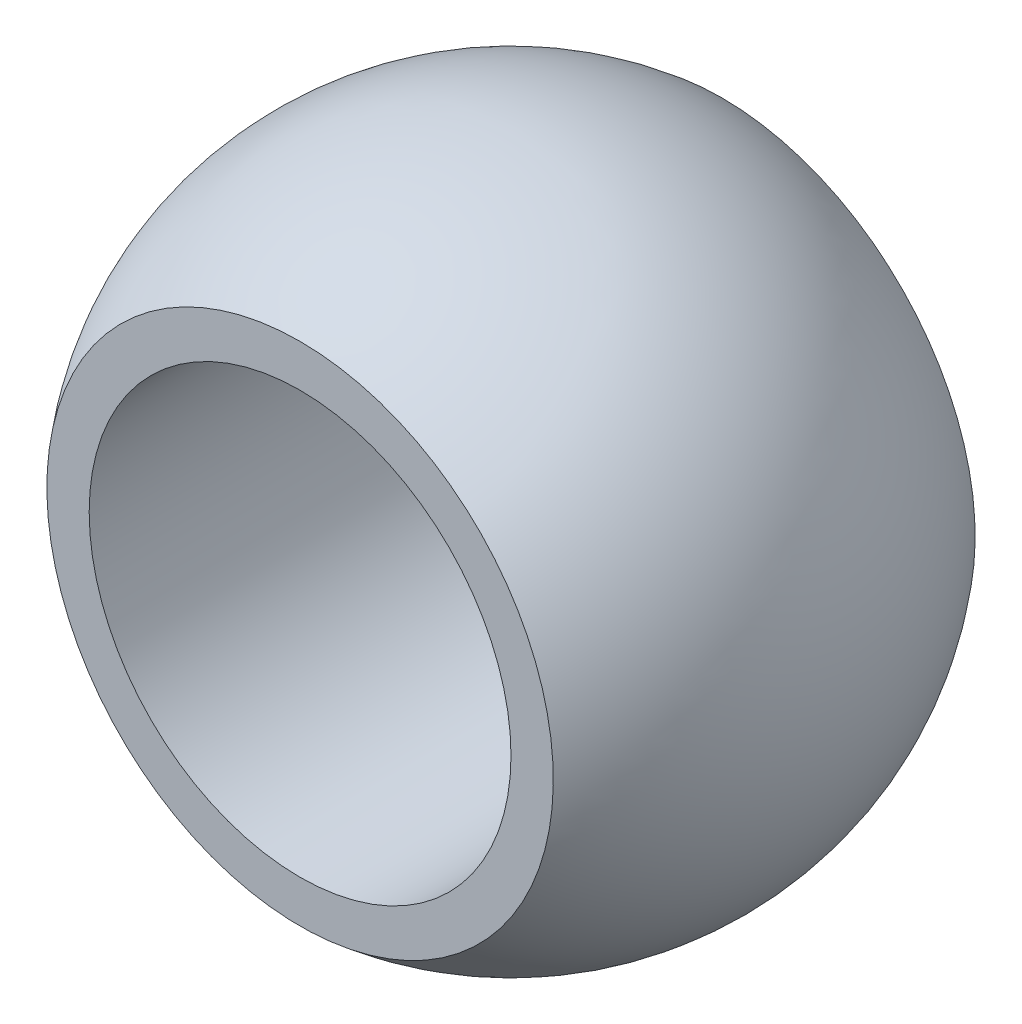
ISO-10303-21;
HEADER;
FILE_DESCRIPTION(('STEP AP214'),'2;1');
FILE_NAME('part.step','',(''),(''),'','','');
FILE_SCHEMA(('AUTOMOTIVE_DESIGN { 1 0 10303 214 1 1 1 1 }'));
ENDSEC;
DATA;
#1=APPLICATION_CONTEXT('core data for automotive mechanical design processes');
#2=APPLICATION_PROTOCOL_DEFINITION('international standard','automotive_design',2000,#1);
#3=PRODUCT_CONTEXT('',#1,'mechanical');
#4=PRODUCT('Part','Part','',(#3));
#5=PRODUCT_RELATED_PRODUCT_CATEGORY('part','',(#4));
#6=PRODUCT_DEFINITION_FORMATION('','',#4);
#7=PRODUCT_DEFINITION_CONTEXT('part definition',#1,'design');
#8=PRODUCT_DEFINITION('design','',#6,#7);
#9=PRODUCT_DEFINITION_SHAPE('','',#8);
#10=(LENGTH_UNIT() NAMED_UNIT(*) SI_UNIT(.MILLI.,.METRE.));
#11=(NAMED_UNIT(*) PLANE_ANGLE_UNIT() SI_UNIT($,.RADIAN.));
#12=(NAMED_UNIT(*) SI_UNIT($,.STERADIAN.) SOLID_ANGLE_UNIT());
#13=UNCERTAINTY_MEASURE_WITH_UNIT(LENGTH_MEASURE(1.E-05),#10,'distance_accuracy_value','');
#14=(GEOMETRIC_REPRESENTATION_CONTEXT(3) GLOBAL_UNCERTAINTY_ASSIGNED_CONTEXT((#13)) GLOBAL_UNIT_ASSIGNED_CONTEXT((#10,
#11,#12)) REPRESENTATION_CONTEXT('',''));
#15=CARTESIAN_POINT('',(0.,0.,0.));
#16=DIRECTION('',(0.,0.,1.));
#17=DIRECTION('',(1.,0.,0.));
#18=AXIS2_PLACEMENT_3D('',#15,#16,#17);
#19=CARTESIAN_POINT('',(0.,4.80234317807464,4.));
#20=DIRECTION('',(0.,0.,-1.));
#21=DIRECTION('',(-1.,0.,0.));
#22=AXIS2_PLACEMENT_3D('',#19,#20,#21);
#23=PLANE('',#22);
#24=CARTESIAN_POINT('',(0.,0.,4.));
#25=DIRECTION('',(0.,0.,1.));
#26=DIRECTION('',(1.,0.,0.));
#27=AXIS2_PLACEMENT_3D('',#24,#25,#26);
#28=CIRCLE('',#27,4.);
#29=CARTESIAN_POINT('',(4.,0.,4.));
#30=VERTEX_POINT('',#29);
#31=EDGE_CURVE('E10',#30,#30,#28,.T.);
#32=ORIENTED_EDGE('',*,*,#31,.F.);
#33=EDGE_LOOP('',(#32));
#34=FACE_BOUND('',#33,.T.);
#35=CARTESIAN_POINT('',(0.,0.,4.));
#36=DIRECTION('',(0.,0.,1.));
#37=DIRECTION('',(1.,0.,0.));
#38=AXIS2_PLACEMENT_3D('',#35,#36,#37);
#39=CIRCLE('',#38,4.80234317807464);
#40=CARTESIAN_POINT('',(0.,4.80234317807464,4.));
#41=VERTEX_POINT('',#40);
#42=EDGE_CURVE('E44',#41,#41,#39,.T.);
#43=ORIENTED_EDGE('',*,*,#42,.T.);
#44=EDGE_LOOP('',(#43));
#45=FACE_BOUND('',#44,.T.);
#46=ADVANCED_FACE('F30',(#34,#45),#23,.F.);
#47=CARTESIAN_POINT('',(0.,0.,4.));
#48=DIRECTION('',(0.,0.,1.));
#49=DIRECTION('',(1.,0.,0.));
#50=AXIS2_PLACEMENT_3D('',#47,#48,#49);
#51=CYLINDRICAL_SURFACE('',#50,4.);
#52=CARTESIAN_POINT('',(0.,0.,-4.));
#53=DIRECTION('',(0.,0.,1.));
#54=DIRECTION('',(1.,0.,0.));
#55=AXIS2_PLACEMENT_3D('',#52,#53,#54);
#56=CIRCLE('',#55,4.);
#57=CARTESIAN_POINT('',(4.,0.,-4.));
#58=VERTEX_POINT('',#57);
#59=EDGE_CURVE('E36',#58,#58,#56,.T.);
#60=ORIENTED_EDGE('',*,*,#59,.F.);
#61=EDGE_LOOP('',(#60));
#62=FACE_BOUND('',#61,.T.);
#63=ORIENTED_EDGE('',*,*,#31,.T.);
#64=EDGE_LOOP('',(#63));
#65=FACE_BOUND('',#64,.T.);
#66=ADVANCED_FACE('F59',(#62,#65),#51,.F.);
#67=CARTESIAN_POINT('',(0.,4.80234317807464,-4.));
#68=DIRECTION('',(0.,0.,1.));
#69=DIRECTION('',(1.,0.,0.));
#70=AXIS2_PLACEMENT_3D('',#67,#68,#69);
#71=PLANE('',#70);
#72=CARTESIAN_POINT('',(0.,0.,-4.));
#73=DIRECTION('',(0.,0.,1.));
#74=DIRECTION('',(1.,0.,0.));
#75=AXIS2_PLACEMENT_3D('',#72,#73,#74);
#76=CIRCLE('',#75,4.80234317807464);
#77=CARTESIAN_POINT('',(0.,4.80234317807464,-4.));
#78=VERTEX_POINT('',#77);
#79=EDGE_CURVE('E40',#78,#78,#76,.T.);
#80=ORIENTED_EDGE('',*,*,#79,.F.);
#81=EDGE_LOOP('',(#80));
#82=FACE_BOUND('',#81,.T.);
#83=ORIENTED_EDGE('',*,*,#59,.T.);
#84=EDGE_LOOP('',(#83));
#85=FACE_BOUND('',#84,.T.);
#86=ADVANCED_FACE('F54',(#82,#85),#71,.F.);
#87=CARTESIAN_POINT('',(0.,0.,0.));
#88=DIRECTION('',(0.,0.,1.));
#89=DIRECTION('',(0.,1.,0.));
#90=AXIS2_PLACEMENT_3D('',#87,#88,#89);
#91=SPHERICAL_SURFACE('',#90,6.25);
#92=CARTESIAN_POINT('',(0.,4.80234317807464,4.));
#93=CARTESIAN_POINT('',(0.,4.86021908865252,3.93051707682293));
#94=CARTESIAN_POINT('',(0.,4.9165849226692,3.85977650040231));
#95=CARTESIAN_POINT('',(0.,5.02619489369063,3.7159168357477));
#96=CARTESIAN_POINT('',(0.,5.07943903069538,3.64279774751371));
#97=CARTESIAN_POINT('',(0.,5.1827040638034,3.49431785390617));
#98=CARTESIAN_POINT('',(0.,5.23272495990667,3.4189570485326));
#99=CARTESIAN_POINT('',(0.,5.32944961496876,3.26613593884275));
#100=CARTESIAN_POINT('',(0.,5.37615337392757,3.18867563452645));
#101=CARTESIAN_POINT('',(0.,5.46615568506055,3.03180137848343));
#102=CARTESIAN_POINT('',(0.,5.50945423723472,2.9523874267567));
#103=CARTESIAN_POINT('',(0.,5.59256459300888,2.79175549389879));
#104=CARTESIAN_POINT('',(0.,5.63237639660886,2.71053751276763));
#105=CARTESIAN_POINT('',(0.,5.70843825145934,2.54645051443596));
#106=CARTESIAN_POINT('',(0.,5.74468830270983,2.46358149723546));
#107=CARTESIAN_POINT('',(0.,5.81355836682803,2.29634853650632));
#108=CARTESIAN_POINT('',(0.,5.84617837969574,2.21198459297768));
#109=CARTESIAN_POINT('',(0.,5.90772691709532,2.04192070381338));
#110=CARTESIAN_POINT('',(0.,5.93665544162718,1.95622075817773));
#111=CARTESIAN_POINT('',(0.,5.99076650700101,1.7836463062221));
#112=CARTESIAN_POINT('',(0.,6.01594904784297,1.69677179990212));
#113=CARTESIAN_POINT('',(0.,6.0625207070008,1.52201188051573));
#114=CARTESIAN_POINT('',(0.,6.08390982531665,1.43412646744932));
#115=CARTESIAN_POINT('',(0.,6.12285434666711,1.25751029288328));
#116=CARTESIAN_POINT('',(0.,6.14040974970171,1.16877953138367));
#117=CARTESIAN_POINT('',(0.,6.17165376966595,0.990639810721027));
#118=CARTESIAN_POINT('',(0.,6.18534238659558,0.901230851558007));
#119=CARTESIAN_POINT('',(0.,6.20882704777047,0.721903163927604));
#120=CARTESIAN_POINT('',(0.,6.21862309201573,0.631984435460222));
#121=CARTESIAN_POINT('',(0.,6.23430415405971,0.451806597881577));
#122=CARTESIAN_POINT('',(0.,6.24018917185844,0.361547488770314));
#123=CARTESIAN_POINT('',(0.,6.24803709482858,0.1808589197727));
#124=CARTESIAN_POINT('',(0.,6.25,0.0904294598863502));
#125=CARTESIAN_POINT('',(0.,6.25,-0.0904294598863502));
#126=CARTESIAN_POINT('',(0.,6.24803709482858,-0.1808589197727));
#127=CARTESIAN_POINT('',(0.,6.24018917185844,-0.361547488770314));
#128=CARTESIAN_POINT('',(0.,6.23430415405971,-0.451806597881577));
#129=CARTESIAN_POINT('',(0.,6.21862309201573,-0.631984435460222));
#130=CARTESIAN_POINT('',(0.,6.20882704777047,-0.721903163927604));
#131=CARTESIAN_POINT('',(0.,6.18534238659558,-0.901230851558007));
#132=CARTESIAN_POINT('',(0.,6.17165376966595,-0.990639810721027));
#133=CARTESIAN_POINT('',(0.,6.14040974970171,-1.16877953138367));
#134=CARTESIAN_POINT('',(0.,6.12285434666711,-1.25751029288328));
#135=CARTESIAN_POINT('',(0.,6.08390982531665,-1.43412646744932));
#136=CARTESIAN_POINT('',(0.,6.0625207070008,-1.52201188051573));
#137=CARTESIAN_POINT('',(0.,6.01594904784297,-1.69677179990212));
#138=CARTESIAN_POINT('',(0.,5.99076650700101,-1.7836463062221));
#139=CARTESIAN_POINT('',(0.,5.93665544162718,-1.95622075817773));
#140=CARTESIAN_POINT('',(0.,5.90772691709532,-2.04192070381338));
#141=CARTESIAN_POINT('',(0.,5.84617837969574,-2.21198459297768));
#142=CARTESIAN_POINT('',(0.,5.81355836682803,-2.29634853650632));
#143=CARTESIAN_POINT('',(0.,5.74468830270983,-2.46358149723546));
#144=CARTESIAN_POINT('',(0.,5.70843825145934,-2.54645051443596));
#145=CARTESIAN_POINT('',(0.,5.63237639660886,-2.71053751276763));
#146=CARTESIAN_POINT('',(0.,5.59256459300888,-2.79175549389879));
#147=CARTESIAN_POINT('',(0.,5.50945423723472,-2.9523874267567));
#148=CARTESIAN_POINT('',(0.,5.46615568506055,-3.03180137848343));
#149=CARTESIAN_POINT('',(0.,5.37615337392757,-3.18867563452645));
#150=CARTESIAN_POINT('',(0.,5.32944961496876,-3.26613593884275));
#151=CARTESIAN_POINT('',(0.,5.23272495990667,-3.4189570485326));
#152=CARTESIAN_POINT('',(0.,5.1827040638034,-3.49431785390617));
#153=CARTESIAN_POINT('',(0.,5.07943903069538,-3.64279774751371));
#154=CARTESIAN_POINT('',(0.,5.02619489369063,-3.7159168357477));
#155=CARTESIAN_POINT('',(0.,4.9165849226692,-3.85977650040231));
#156=CARTESIAN_POINT('',(0.,4.86021908865252,-3.93051707682293));
#157=CARTESIAN_POINT('',(0.,4.80234317807464,-4.));
#158=B_SPLINE_CURVE_WITH_KNOTS('',3,(#92,#93,#94,#95,#96,#97,#98,#99,#100,#101,#102,#103,#104,
#105,#106,#107,#108,#109,#110,#111,#112,#113,#114,#115,#116,#117,#118,#119,#120,#121,#122,#123,
#124,#125,#126,#127,#128,#129,#130,#131,#132,#133,#134,#135,#136,#137,#138,#139,#140,#141,#142,
#143,#144,#145,#146,#147,#148,#149,#150,#151,#152,#153,#154,#155,#156,#157),.UNSPECIFIED.,.F.,
.F.,(4,2,2,2,2,2,2,2,2,2,2,2,2,2,2,2,2,2,2,2,2,2,2,2,2,2,2,2,2,2,2,2,4),(0.,0.27126708832102,
0.542534176642041,0.81380126496306,1.08506835328408,1.3563354416051,1.62760252992612,
1.89886961824714,2.17013670656816,2.44140379488918,2.7126708832102,2.98393797153122,
3.25520505985224,3.52647214817326,3.79773923649428,4.0690063248153,4.34027341313632,
4.61154050145734,4.88280758977836,5.15407467809938,5.4253417664204,5.69660885474142,
5.96787594306245,6.23914303138347,6.51041011970449,6.78167720802551,7.05294429634653,
7.32421138466755,7.59547847298857,7.86674556130959,8.13801264963061,8.40927973795162,
8.68054682627264),.UNSPECIFIED.);
#159=EDGE_CURVE('BSEAM51',#41,#78,#158,.T.);
#160=ORIENTED_EDGE('',*,*,#42,.F.);
#161=ORIENTED_EDGE('',*,*,#79,.T.);
#162=ORIENTED_EDGE('',*,*,#159,.T.);
#163=ORIENTED_EDGE('',*,*,#159,.F.);
#164=EDGE_LOOP('',(#160,#162,#161,#163));
#165=FACE_BOUND('',#164,.T.);
#166=ADVANCED_FACE('F51',(#165),#91,.T.);
#167=CLOSED_SHELL('',(#46,#66,#86,#166));
#168=MANIFOLD_SOLID_BREP('B2',#167);
#169=ADVANCED_BREP_SHAPE_REPRESENTATION('',(#18,#168),#14);
#170=SHAPE_DEFINITION_REPRESENTATION(#9,#169);
ENDSEC;
END-ISO-10303-21;
